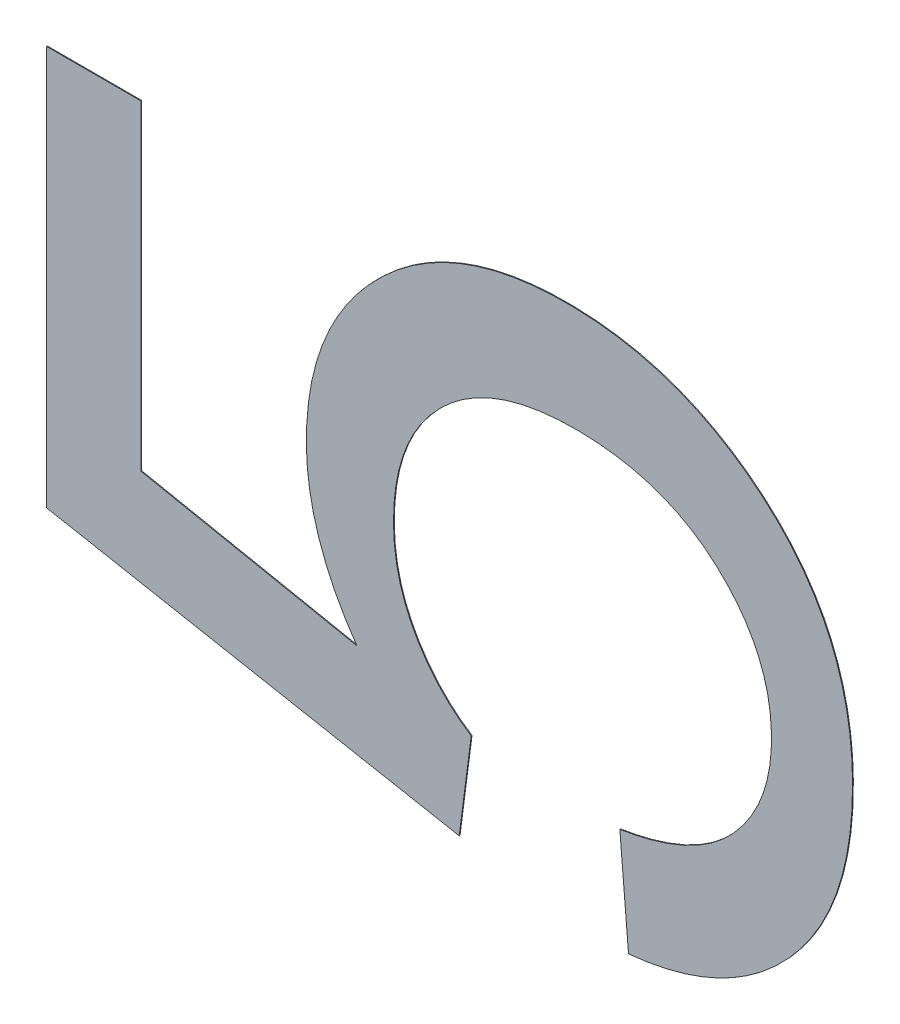
ISO-10303-21;
HEADER;
FILE_DESCRIPTION(('STEP AP214'),'2;1');
FILE_NAME('part.step','',(''),(''),'','','');
FILE_SCHEMA(('AUTOMOTIVE_DESIGN { 1 0 10303 214 1 1 1 1 }'));
ENDSEC;
DATA;
#1=APPLICATION_CONTEXT('core data for automotive mechanical design processes');
#2=APPLICATION_PROTOCOL_DEFINITION('international standard','automotive_design',2000,#1);
#3=PRODUCT_CONTEXT('',#1,'mechanical');
#4=PRODUCT('Part','Part','',(#3));
#5=PRODUCT_RELATED_PRODUCT_CATEGORY('part','',(#4));
#6=PRODUCT_DEFINITION_FORMATION('','',#4);
#7=PRODUCT_DEFINITION_CONTEXT('part definition',#1,'design');
#8=PRODUCT_DEFINITION('design','',#6,#7);
#9=PRODUCT_DEFINITION_SHAPE('','',#8);
#10=(LENGTH_UNIT() NAMED_UNIT(*) SI_UNIT(.MILLI.,.METRE.));
#11=(NAMED_UNIT(*) PLANE_ANGLE_UNIT() SI_UNIT($,.RADIAN.));
#12=(NAMED_UNIT(*) SI_UNIT($,.STERADIAN.) SOLID_ANGLE_UNIT());
#13=UNCERTAINTY_MEASURE_WITH_UNIT(LENGTH_MEASURE(1.E-05),#10,'distance_accuracy_value','');
#14=(GEOMETRIC_REPRESENTATION_CONTEXT(3) GLOBAL_UNCERTAINTY_ASSIGNED_CONTEXT((#13)) GLOBAL_UNIT_ASSIGNED_CONTEXT((#10,
#11,#12)) REPRESENTATION_CONTEXT('',''));
#15=CARTESIAN_POINT('',(0.,0.,0.));
#16=DIRECTION('',(0.,0.,1.));
#17=DIRECTION('',(1.,0.,0.));
#18=AXIS2_PLACEMENT_3D('',#15,#16,#17);
#19=CARTESIAN_POINT('',(139.654471045631,-43.7284018825457,0.002));
#20=DIRECTION('',(0.996479998500645,0.0838308570167019,0.));
#21=DIRECTION('',(-0.0838308570167019,0.996479998500645,0.));
#22=AXIS2_PLACEMENT_3D('',#19,#20,#21);
#23=PLANE('',#22);
#24=CARTESIAN_POINT('',(139.654471045631,-43.7284018825457,0.));
#25=CARTESIAN_POINT('',(139.661701111793,-43.8143441784328,0.));
#26=CARTESIAN_POINT('',(139.668931177955,-43.9002864743198,0.));
#27=CARTESIAN_POINT('',(139.676161244117,-43.9862287702068,0.));
#28=B_SPLINE_CURVE_WITH_KNOTS('',3,(#24,#25,#26,#27),.UNSPECIFIED.,.F.,.F.,(4,4),(0.,
0.0272894040807523),.UNSPECIFIED.);
#29=CARTESIAN_POINT('',(139.654471045631,-43.7284018825457,0.));
#30=VERTEX_POINT('',#29);
#31=CARTESIAN_POINT('',(139.676161244117,-43.9862287702068,0.));
#32=VERTEX_POINT('',#31);
#33=EDGE_CURVE('E96',#30,#32,#28,.T.);
#34=ORIENTED_EDGE('',*,*,#33,.T.);
#35=DIRECTION('',(0.,0.,-1.));
#36=VECTOR('',#35,1.);
#37=CARTESIAN_POINT('',(139.676161244117,-43.9862287702068,0.002));
#38=LINE('',#37,#36);
#39=CARTESIAN_POINT('',(139.676161244117,-43.9862287702068,0.002));
#40=VERTEX_POINT('',#39);
#41=EDGE_CURVE('E105',#40,#32,#38,.T.);
#42=ORIENTED_EDGE('',*,*,#41,.F.);
#43=CARTESIAN_POINT('',(139.654471045631,-43.7284018825457,0.002));
#44=CARTESIAN_POINT('',(139.661701111793,-43.8143441784328,0.002));
#45=CARTESIAN_POINT('',(139.668931177955,-43.9002864743198,0.002));
#46=CARTESIAN_POINT('',(139.676161244117,-43.9862287702068,0.002));
#47=B_SPLINE_CURVE_WITH_KNOTS('',3,(#43,#44,#45,#46),.UNSPECIFIED.,.F.,.F.,(4,4),(0.,
0.0272894040807523),.UNSPECIFIED.);
#48=CARTESIAN_POINT('',(139.654471045631,-43.7284018825457,0.002));
#49=VERTEX_POINT('',#48);
#50=EDGE_CURVE('E110',#49,#40,#47,.T.);
#51=ORIENTED_EDGE('',*,*,#50,.F.);
#52=DIRECTION('',(0.,0.,-1.));
#53=VECTOR('',#52,1.);
#54=CARTESIAN_POINT('',(139.654471045631,-43.7284018825457,0.002));
#55=LINE('',#54,#53);
#56=EDGE_CURVE('E102',#49,#30,#55,.T.);
#57=ORIENTED_EDGE('',*,*,#56,.T.);
#58=EDGE_LOOP('',(#34,#42,#51,#57));
#59=FACE_BOUND('',#58,.T.);
#60=ADVANCED_FACE('F17',(#59),#23,.F.);
#61=CARTESIAN_POINT('',(139.676161244117,-43.9862287702068,0.002));
#62=CARTESIAN_POINT('',(139.844362594639,-43.9698588090855,0.002));
#63=CARTESIAN_POINT('',(139.97941477389,-43.9039697155721,0.002));
#64=CARTESIAN_POINT('',(140.183220789851,-43.6739717618173,0.002));
#65=CARTESIAN_POINT('',(140.233967669327,-43.5254143646411,0.002));
#66=CARTESIAN_POINT('',(140.233967669327,-43.1214855739719,0.002));
#67=CARTESIAN_POINT('',(140.153345610804,-42.9467362390016,0.002));
#68=CARTESIAN_POINT('',(139.85896978656,-42.7133170248285,0.002));
#69=CARTESIAN_POINT('',(139.703171679967,-42.65985267035,0.002));
#70=CARTESIAN_POINT('',(139.331982811541,-42.65985267035,0.002));
#71=CARTESIAN_POINT('',(139.176468180888,-42.720012277471,0.002));
#72=CARTESIAN_POINT('',(138.934194152982,-42.9598308253644,0.002));
#73=CARTESIAN_POINT('',(138.874033149171,-43.1075711070188,0.002));
#74=CARTESIAN_POINT('',(138.874033149171,-43.4140986290159,0.002));
#75=CARTESIAN_POINT('',(138.915776550031,-43.5401473296502,0.002));
#76=CARTESIAN_POINT('',(138.999672600778,-43.6600572948641,0.002));
#77=B_SPLINE_CURVE_WITH_KNOTS('',3,(#61,#62,#63,#64,#65,#66,#67,#68,#69,#70,#71,#72,#73,#74,#75,
#76),.UNSPECIFIED.,.F.,.F.,(4,2,2,2,2,2,2,4),(0.0272894040807523,0.0760086306221566,
0.124727857163561,0.184310154487846,0.232955086955021,0.283905986875495,0.334856299343827,
0.373277846451094),.UNSPECIFIED.);
#78=DIRECTION('',(0.,0.,-1.));
#79=VECTOR('',#78,1.);
#80=SURFACE_OF_LINEAR_EXTRUSION('',#77,#79);
#81=CARTESIAN_POINT('',(139.676161244117,-43.9862287702068,0.));
#82=CARTESIAN_POINT('',(139.844362594639,-43.9698588090855,0.));
#83=CARTESIAN_POINT('',(139.97941477389,-43.9039697155721,0.));
#84=CARTESIAN_POINT('',(140.183220789851,-43.6739717618173,0.));
#85=CARTESIAN_POINT('',(140.233967669327,-43.5254143646411,0.));
#86=CARTESIAN_POINT('',(140.233967669327,-43.1214855739719,0.));
#87=CARTESIAN_POINT('',(140.153345610804,-42.9467362390016,0.));
#88=CARTESIAN_POINT('',(139.85896978656,-42.7133170248285,0.));
#89=CARTESIAN_POINT('',(139.703171679967,-42.65985267035,0.));
#90=CARTESIAN_POINT('',(139.331982811541,-42.65985267035,0.));
#91=CARTESIAN_POINT('',(139.176468180888,-42.720012277471,0.));
#92=CARTESIAN_POINT('',(138.934194152982,-42.9598308253644,0.));
#93=CARTESIAN_POINT('',(138.874033149171,-43.1075711070188,0.));
#94=CARTESIAN_POINT('',(138.874033149171,-43.4140986290159,0.));
#95=CARTESIAN_POINT('',(138.915776550031,-43.5401473296502,0.));
#96=CARTESIAN_POINT('',(138.999672600778,-43.6600572948641,0.));
#97=B_SPLINE_CURVE_WITH_KNOTS('',3,(#81,#82,#83,#84,#85,#86,#87,#88,#89,#90,#91,#92,#93,#94,#95,
#96),.UNSPECIFIED.,.F.,.F.,(4,2,2,2,2,2,2,4),(0.0272894040807523,0.0760086306221566,
0.124727857163561,0.184310154487846,0.232955086955021,0.283905986875495,0.334856299343827,
0.373277846451094),.UNSPECIFIED.);
#98=CARTESIAN_POINT('',(138.999672600778,-43.6600572948641,0.));
#99=VERTEX_POINT('',#98);
#100=EDGE_CURVE('E93',#32,#99,#97,.T.);
#101=ORIENTED_EDGE('',*,*,#100,.T.);
#102=DIRECTION('',(0.,0.,-1.));
#103=VECTOR('',#102,1.);
#104=CARTESIAN_POINT('',(138.999672600778,-43.6600572948641,0.002));
#105=LINE('',#104,#103);
#106=CARTESIAN_POINT('',(138.999672600778,-43.6600572948641,0.002));
#107=VERTEX_POINT('',#106);
#108=EDGE_CURVE('E101',#107,#99,#105,.T.);
#109=ORIENTED_EDGE('',*,*,#108,.F.);
#110=EDGE_CURVE('E87',#40,#107,#77,.T.);
#111=ORIENTED_EDGE('',*,*,#110,.F.);
#112=ORIENTED_EDGE('',*,*,#41,.T.);
#113=EDGE_LOOP('',(#101,#109,#111,#112));
#114=FACE_BOUND('',#113,.T.);
#115=ADVANCED_FACE('F106',(#114),#80,.F.);
#116=CARTESIAN_POINT('',(138.999672600778,-43.6600572948641,0.002));
#117=DIRECTION('',(-0.196259639647848,-0.980551963867952,0.));
#118=DIRECTION('',(0.980551963867952,-0.196259639647848,0.));
#119=AXIS2_PLACEMENT_3D('',#116,#117,#118);
#120=PLANE('',#119);
#121=CARTESIAN_POINT('',(138.999672600778,-43.6600572948641,0.));
#122=CARTESIAN_POINT('',(138.820421526499,-43.6241797967398,0.));
#123=CARTESIAN_POINT('',(138.64117045222,-43.5883022986156,0.));
#124=CARTESIAN_POINT('',(138.461919377941,-43.5524248004913,0.));
#125=B_SPLINE_CURVE_WITH_KNOTS('',3,(#121,#122,#123,#124),.UNSPECIFIED.,.F.,.F.,(4,4),
(0.373277846451094,0.428335755669182),.UNSPECIFIED.);
#126=CARTESIAN_POINT('',(138.461919377941,-43.5524248004913,0.));
#127=VERTEX_POINT('',#126);
#128=EDGE_CURVE('E98',#99,#127,#125,.T.);
#129=ORIENTED_EDGE('',*,*,#128,.T.);
#130=DIRECTION('',(0.,0.,-1.));
#131=VECTOR('',#130,1.);
#132=CARTESIAN_POINT('',(138.461919377941,-43.5524248004913,0.002));
#133=LINE('',#132,#131);
#134=CARTESIAN_POINT('',(138.461919377941,-43.5524248004913,0.002));
#135=VERTEX_POINT('',#134);
#136=EDGE_CURVE('E353',#135,#127,#133,.T.);
#137=ORIENTED_EDGE('',*,*,#136,.F.);
#138=CARTESIAN_POINT('',(138.999672600778,-43.6600572948641,0.002));
#139=CARTESIAN_POINT('',(138.820421526499,-43.6241797967398,0.002));
#140=CARTESIAN_POINT('',(138.64117045222,-43.5883022986156,0.002));
#141=CARTESIAN_POINT('',(138.461919377941,-43.5524248004913,0.002));
#142=B_SPLINE_CURVE_WITH_KNOTS('',3,(#138,#139,#140,#141),.UNSPECIFIED.,.F.,.F.,(4,4),
(0.373277846451094,0.428335755669182),.UNSPECIFIED.);
#143=EDGE_CURVE('E346',#107,#135,#142,.T.);
#144=ORIENTED_EDGE('',*,*,#143,.F.);
#145=ORIENTED_EDGE('',*,*,#108,.T.);
#146=EDGE_LOOP('',(#129,#137,#144,#145));
#147=FACE_BOUND('',#146,.T.);
#148=ADVANCED_FACE('F161',(#147),#120,.F.);
#149=CARTESIAN_POINT('',(138.461919377941,-43.5524248004913,0.002));
#150=DIRECTION('',(-1.,0.,0.));
#151=DIRECTION('',(0.,0.,1.));
#152=AXIS2_PLACEMENT_3D('',#149,#150,#151);
#153=PLANE('',#152);
#154=CARTESIAN_POINT('',(138.461919377941,-43.5524248004913,0.));
#155=CARTESIAN_POINT('',(138.461919377941,-43.2862765159268,0.));
#156=CARTESIAN_POINT('',(138.461919377941,-43.0201282313623,0.));
#157=CARTESIAN_POINT('',(138.461919377941,-42.7539799467978,0.));
#158=B_SPLINE_CURVE_WITH_KNOTS('',3,(#154,#155,#156,#157),.UNSPECIFIED.,.F.,.F.,(4,4),
(0.428335755669182,0.50849474509918),.UNSPECIFIED.);
#159=CARTESIAN_POINT('',(138.461919377941,-42.7539799467978,0.));
#160=VERTEX_POINT('',#159);
#161=EDGE_CURVE('E342',#127,#160,#158,.T.);
#162=ORIENTED_EDGE('',*,*,#161,.T.);
#163=DIRECTION('',(0.,0.,-1.));
#164=VECTOR('',#163,1.);
#165=CARTESIAN_POINT('',(138.461919377941,-42.7539799467978,0.002));
#166=LINE('',#165,#164);
#167=CARTESIAN_POINT('',(138.461919377941,-42.7539799467978,0.002));
#168=VERTEX_POINT('',#167);
#169=EDGE_CURVE('E337',#168,#160,#166,.T.);
#170=ORIENTED_EDGE('',*,*,#169,.F.);
#171=CARTESIAN_POINT('',(138.461919377941,-43.5524248004913,0.002));
#172=CARTESIAN_POINT('',(138.461919377941,-43.2862765159268,0.002));
#173=CARTESIAN_POINT('',(138.461919377941,-43.0201282313623,0.002));
#174=CARTESIAN_POINT('',(138.461919377941,-42.7539799467978,0.002));
#175=B_SPLINE_CURVE_WITH_KNOTS('',3,(#171,#172,#173,#174),.UNSPECIFIED.,.F.,.F.,(4,4),
(0.428335755669182,0.50849474509918),.UNSPECIFIED.);
#176=EDGE_CURVE('E330',#135,#168,#175,.T.);
#177=ORIENTED_EDGE('',*,*,#176,.F.);
#178=ORIENTED_EDGE('',*,*,#136,.T.);
#179=EDGE_LOOP('',(#162,#170,#177,#178));
#180=FACE_BOUND('',#179,.T.);
#181=ADVANCED_FACE('F164',(#180),#153,.F.);
#182=CARTESIAN_POINT('',(138.461919377941,-42.7539799467978,0.002));
#183=DIRECTION('',(0.,-1.,0.));
#184=DIRECTION('',(0.,0.,-1.));
#185=AXIS2_PLACEMENT_3D('',#182,#183,#184);
#186=PLANE('',#185);
#187=CARTESIAN_POINT('',(138.461919377941,-42.7539799467978,0.));
#188=CARTESIAN_POINT('',(138.383752813587,-42.7539799467978,0.));
#189=CARTESIAN_POINT('',(138.305586249233,-42.7539799467978,0.));
#190=CARTESIAN_POINT('',(138.227419684878,-42.7539799467978,0.));
#191=B_SPLINE_CURVE_WITH_KNOTS('',3,(#187,#188,#189,#190),.UNSPECIFIED.,.F.,.F.,(4,4),
(0.50849474509918,0.532037082845662),.UNSPECIFIED.);
#192=CARTESIAN_POINT('',(138.227419684878,-42.7539799467978,0.));
#193=VERTEX_POINT('',#192);
#194=EDGE_CURVE('E326',#160,#193,#191,.T.);
#195=ORIENTED_EDGE('',*,*,#194,.T.);
#196=DIRECTION('',(0.,0.,-1.));
#197=VECTOR('',#196,1.);
#198=CARTESIAN_POINT('',(138.227419684878,-42.7539799467978,0.002));
#199=LINE('',#198,#197);
#200=CARTESIAN_POINT('',(138.227419684878,-42.7539799467978,0.002));
#201=VERTEX_POINT('',#200);
#202=EDGE_CURVE('E321',#201,#193,#199,.T.);
#203=ORIENTED_EDGE('',*,*,#202,.F.);
#204=CARTESIAN_POINT('',(138.461919377941,-42.7539799467978,0.002));
#205=CARTESIAN_POINT('',(138.383752813587,-42.7539799467978,0.002));
#206=CARTESIAN_POINT('',(138.305586249233,-42.7539799467978,0.002));
#207=CARTESIAN_POINT('',(138.227419684878,-42.7539799467978,0.002));
#208=B_SPLINE_CURVE_WITH_KNOTS('',3,(#204,#205,#206,#207),.UNSPECIFIED.,.F.,.F.,(4,4),
(0.50849474509918,0.532037082845662),.UNSPECIFIED.);
#209=EDGE_CURVE('E314',#168,#201,#208,.T.);
#210=ORIENTED_EDGE('',*,*,#209,.F.);
#211=ORIENTED_EDGE('',*,*,#169,.T.);
#212=EDGE_LOOP('',(#195,#203,#210,#211));
#213=FACE_BOUND('',#212,.T.);
#214=ADVANCED_FACE('F168',(#213),#186,.F.);
#215=CARTESIAN_POINT('',(138.227419684878,-42.7539799467978,0.002));
#216=DIRECTION('',(1.,0.,0.));
#217=DIRECTION('',(0.,0.,-1.));
#218=AXIS2_PLACEMENT_3D('',#215,#216,#217);
#219=PLANE('',#218);
#220=CARTESIAN_POINT('',(138.227419684878,-42.7539799467978,0.));
#221=CARTESIAN_POINT('',(138.227419684878,-43.0856080758476,0.));
#222=CARTESIAN_POINT('',(138.227419684878,-43.4172362048975,0.));
#223=CARTESIAN_POINT('',(138.227419684878,-43.7488643339474,0.));
#224=B_SPLINE_CURVE_WITH_KNOTS('',3,(#220,#221,#222,#223),.UNSPECIFIED.,.F.,.F.,(4,4),
(0.532037082845662,0.63191740232507),.UNSPECIFIED.);
#225=CARTESIAN_POINT('',(138.227419684878,-43.7488643339474,0.));
#226=VERTEX_POINT('',#225);
#227=EDGE_CURVE('E310',#193,#226,#224,.T.);
#228=ORIENTED_EDGE('',*,*,#227,.T.);
#229=DIRECTION('',(0.,0.,-1.));
#230=VECTOR('',#229,1.);
#231=CARTESIAN_POINT('',(138.227419684878,-43.7488643339474,0.002));
#232=LINE('',#231,#230);
#233=CARTESIAN_POINT('',(138.227419684878,-43.7488643339474,0.002));
#234=VERTEX_POINT('',#233);
#235=EDGE_CURVE('E305',#234,#226,#232,.T.);
#236=ORIENTED_EDGE('',*,*,#235,.F.);
#237=CARTESIAN_POINT('',(138.227419684878,-42.7539799467978,0.002));
#238=CARTESIAN_POINT('',(138.227419684878,-43.0856080758476,0.002));
#239=CARTESIAN_POINT('',(138.227419684878,-43.4172362048975,0.002));
#240=CARTESIAN_POINT('',(138.227419684878,-43.7488643339474,0.002));
#241=B_SPLINE_CURVE_WITH_KNOTS('',3,(#237,#238,#239,#240),.UNSPECIFIED.,.F.,.F.,(4,4),
(0.532037082845662,0.63191740232507),.UNSPECIFIED.);
#242=EDGE_CURVE('E298',#201,#234,#241,.T.);
#243=ORIENTED_EDGE('',*,*,#242,.F.);
#244=ORIENTED_EDGE('',*,*,#202,.T.);
#245=EDGE_LOOP('',(#228,#236,#243,#244));
#246=FACE_BOUND('',#245,.T.);
#247=ADVANCED_FACE('F172',(#246),#219,.F.);
#248=CARTESIAN_POINT('',(138.227419684878,-43.7488643339474,0.002));
#249=DIRECTION('',(0.185186727104417,0.982703351019194,0.));
#250=DIRECTION('',(-0.982703351019194,0.185186727104417,0.));
#251=AXIS2_PLACEMENT_3D('',#248,#249,#250);
#252=PLANE('',#251);
#253=CARTESIAN_POINT('',(138.227419684878,-43.7488643339474,0.));
#254=CARTESIAN_POINT('',(138.569824705,-43.813389264034,0.));
#255=CARTESIAN_POINT('',(138.912229725121,-43.8779141941206,0.));
#256=CARTESIAN_POINT('',(139.254634745242,-43.9424391242072,0.));
#257=B_SPLINE_CURVE_WITH_KNOTS('',3,(#253,#254,#255,#256),.UNSPECIFIED.,.F.,.F.,(4,4),
(0.63191740232507,0.736858656071432),.UNSPECIFIED.);
#258=CARTESIAN_POINT('',(139.254634745242,-43.9424391242072,0.));
#259=VERTEX_POINT('',#258);
#260=EDGE_CURVE('E294',#226,#259,#257,.T.);
#261=ORIENTED_EDGE('',*,*,#260,.T.);
#262=DIRECTION('',(0.,0.,-1.));
#263=VECTOR('',#262,1.);
#264=CARTESIAN_POINT('',(139.254634745242,-43.9424391242072,0.002));
#265=LINE('',#264,#263);
#266=CARTESIAN_POINT('',(139.254634745242,-43.9424391242072,0.002));
#267=VERTEX_POINT('',#266);
#268=EDGE_CURVE('E289',#267,#259,#265,.T.);
#269=ORIENTED_EDGE('',*,*,#268,.F.);
#270=CARTESIAN_POINT('',(138.227419684878,-43.7488643339474,0.002));
#271=CARTESIAN_POINT('',(138.569824705,-43.813389264034,0.002));
#272=CARTESIAN_POINT('',(138.912229725121,-43.8779141941206,0.002));
#273=CARTESIAN_POINT('',(139.254634745242,-43.9424391242072,0.002));
#274=B_SPLINE_CURVE_WITH_KNOTS('',3,(#270,#271,#272,#273),.UNSPECIFIED.,.F.,.F.,(4,4),
(0.63191740232507,0.736858656071432),.UNSPECIFIED.);
#275=EDGE_CURVE('E282',#234,#267,#274,.T.);
#276=ORIENTED_EDGE('',*,*,#275,.F.);
#277=ORIENTED_EDGE('',*,*,#235,.T.);
#278=EDGE_LOOP('',(#261,#269,#276,#277));
#279=FACE_BOUND('',#278,.T.);
#280=ADVANCED_FACE('F176',(#279),#252,.F.);
#281=CARTESIAN_POINT('',(139.254634745242,-43.9424391242072,0.002));
#282=DIRECTION('',(-0.991698347568315,0.128586109009779,0.));
#283=DIRECTION('',(-0.128586109009779,-0.991698347568315,0.));
#284=AXIS2_PLACEMENT_3D('',#281,#282,#283);
#285=PLANE('',#284);
#286=CARTESIAN_POINT('',(139.254634745242,-43.9424391242072,0.));
#287=CARTESIAN_POINT('',(139.264593138258,-43.8656367232796,0.));
#288=CARTESIAN_POINT('',(139.274551531273,-43.788834322352,0.));
#289=CARTESIAN_POINT('',(139.284509924289,-43.7120319214243,0.));
#290=B_SPLINE_CURVE_WITH_KNOTS('',3,(#286,#287,#288,#289),.UNSPECIFIED.,.F.,.F.,(4,4),
(0.736858656071432,0.760183769762008),.UNSPECIFIED.);
#291=CARTESIAN_POINT('',(139.284509924289,-43.7120319214243,0.));
#292=VERTEX_POINT('',#291);
#293=EDGE_CURVE('E278',#259,#292,#290,.T.);
#294=ORIENTED_EDGE('',*,*,#293,.T.);
#295=DIRECTION('',(0.,0.,-1.));
#296=VECTOR('',#295,1.);
#297=CARTESIAN_POINT('',(139.284509924289,-43.7120319214243,0.002));
#298=LINE('',#297,#296);
#299=CARTESIAN_POINT('',(139.284509924289,-43.7120319214243,0.002));
#300=VERTEX_POINT('',#299);
#301=EDGE_CURVE('E273',#300,#292,#298,.T.);
#302=ORIENTED_EDGE('',*,*,#301,.F.);
#303=CARTESIAN_POINT('',(139.254634745242,-43.9424391242072,0.002));
#304=CARTESIAN_POINT('',(139.264593138258,-43.8656367232796,0.002));
#305=CARTESIAN_POINT('',(139.274551531273,-43.788834322352,0.002));
#306=CARTESIAN_POINT('',(139.284509924289,-43.7120319214243,0.002));
#307=B_SPLINE_CURVE_WITH_KNOTS('',3,(#303,#304,#305,#306),.UNSPECIFIED.,.F.,.F.,(4,4),
(0.736858656071432,0.760183769762008),.UNSPECIFIED.);
#308=EDGE_CURVE('E38',#267,#300,#307,.T.);
#309=ORIENTED_EDGE('',*,*,#308,.F.);
#310=ORIENTED_EDGE('',*,*,#268,.T.);
#311=EDGE_LOOP('',(#294,#302,#309,#310));
#312=FACE_BOUND('',#311,.T.);
#313=ADVANCED_FACE('F180',(#312),#285,.F.);
#314=CARTESIAN_POINT('',(139.284509924289,-43.7120319214243,0.002));
#315=CARTESIAN_POINT('',(139.227215060364,-43.6756087579293,0.002));
#316=CARTESIAN_POINT('',(139.180560671168,-43.6252711274813,0.002));
#317=CARTESIAN_POINT('',(139.109078538027,-43.4979179017691,0.002));
#318=CARTESIAN_POINT('',(139.090935134029,-43.4267853488849,0.002));
#319=CARTESIAN_POINT('',(139.090935134029,-43.220114589728,0.002));
#320=CARTESIAN_POINT('',(139.131450787804,-43.1173930836916,0.002));
#321=CARTESIAN_POINT('',(139.293508076489,-42.9602466219367,0.002));
#322=CARTESIAN_POINT('',(139.403601391447,-42.9205443012074,0.002));
#323=CARTESIAN_POINT('',(139.691303458154,-42.9205443012074,0.002));
#324=CARTESIAN_POINT('',(139.809576427256,-42.9614692040108,0.002));
#325=CARTESIAN_POINT('',(139.987412019865,-43.1253729760011,0.002));
#326=CARTESIAN_POINT('',(140.032207898506,-43.2254348270924,0.002));
#327=CARTESIAN_POINT('',(140.032207898506,-43.4419275629222,0.002));
#328=CARTESIAN_POINT('',(140.000695723348,-43.5258236136691,0.002));
#329=CARTESIAN_POINT('',(139.874013972705,-43.6647648885673,0.002));
#330=CARTESIAN_POINT('',(139.77970124821,-43.7091671782281,0.002));
#331=CARTESIAN_POINT('',(139.654471045631,-43.7284018825457,0.002));
#332=B_SPLINE_CURVE_WITH_KNOTS('',3,(#314,#315,#316,#317,#318,#319,#320,#321,#322,#323,#324,
#325,#326,#327,#328,#329,#330,#331),.UNSPECIFIED.,.F.,.F.,(4,2,2,2,2,2,2,2,4),
(0.760183769762008,0.780980730108963,0.801937036367264,0.835814588453224,0.869689913672064,
0.905244190869683,0.940887152320097,0.970486843489989,1.),.UNSPECIFIED.);
#333=DIRECTION('',(0.,0.,-1.));
#334=VECTOR('',#333,1.);
#335=SURFACE_OF_LINEAR_EXTRUSION('',#332,#334);
#336=CARTESIAN_POINT('',(139.284509924289,-43.7120319214243,0.));
#337=CARTESIAN_POINT('',(139.227215060364,-43.6756087579293,0.));
#338=CARTESIAN_POINT('',(139.180560671168,-43.6252711274813,0.));
#339=CARTESIAN_POINT('',(139.109078538027,-43.4979179017691,0.));
#340=CARTESIAN_POINT('',(139.090935134029,-43.4267853488849,0.));
#341=CARTESIAN_POINT('',(139.090935134029,-43.220114589728,0.));
#342=CARTESIAN_POINT('',(139.131450787804,-43.1173930836916,0.));
#343=CARTESIAN_POINT('',(139.293508076489,-42.9602466219367,0.));
#344=CARTESIAN_POINT('',(139.403601391447,-42.9205443012074,0.));
#345=CARTESIAN_POINT('',(139.691303458154,-42.9205443012074,0.));
#346=CARTESIAN_POINT('',(139.809576427256,-42.9614692040108,0.));
#347=CARTESIAN_POINT('',(139.987412019865,-43.1253729760011,0.));
#348=CARTESIAN_POINT('',(140.032207898506,-43.2254348270924,0.));
#349=CARTESIAN_POINT('',(140.032207898506,-43.4419275629222,0.));
#350=CARTESIAN_POINT('',(140.000695723348,-43.5258236136691,0.));
#351=CARTESIAN_POINT('',(139.874013972705,-43.6647648885673,0.));
#352=CARTESIAN_POINT('',(139.77970124821,-43.7091671782281,0.));
#353=CARTESIAN_POINT('',(139.654471045631,-43.7284018825457,0.));
#354=B_SPLINE_CURVE_WITH_KNOTS('',3,(#336,#337,#338,#339,#340,#341,#342,#343,#344,#345,#346,
#347,#348,#349,#350,#351,#352,#353),.UNSPECIFIED.,.F.,.F.,(4,2,2,2,2,2,2,2,4),
(0.760183769762008,0.780980730108963,0.801937036367264,0.835814588453224,0.869689913672064,
0.905244190869683,0.940887152320097,0.970486843489989,1.),.UNSPECIFIED.);
#355=EDGE_CURVE('E30',#292,#30,#354,.T.);
#356=ORIENTED_EDGE('',*,*,#355,.T.);
#357=ORIENTED_EDGE('',*,*,#56,.F.);
#358=EDGE_CURVE('E11',#300,#49,#332,.T.);
#359=ORIENTED_EDGE('',*,*,#358,.F.);
#360=ORIENTED_EDGE('',*,*,#301,.T.);
#361=EDGE_LOOP('',(#356,#357,#359,#360));
#362=FACE_BOUND('',#361,.T.);
#363=ADVANCED_FACE('F184',(#362),#335,.F.);
#364=CARTESIAN_POINT('',(139.853272300584,-42.7315940861178,0.002));
#365=DIRECTION('',(0.,0.,-1.));
#366=DIRECTION('',(-1.,0.,0.));
#367=AXIS2_PLACEMENT_3D('',#364,#365,#366);
#368=PLANE('',#367);
#369=ORIENTED_EDGE('',*,*,#50,.T.);
#370=ORIENTED_EDGE('',*,*,#110,.T.);
#371=ORIENTED_EDGE('',*,*,#143,.T.);
#372=ORIENTED_EDGE('',*,*,#176,.T.);
#373=ORIENTED_EDGE('',*,*,#209,.T.);
#374=ORIENTED_EDGE('',*,*,#242,.T.);
#375=ORIENTED_EDGE('',*,*,#275,.T.);
#376=ORIENTED_EDGE('',*,*,#308,.T.);
#377=ORIENTED_EDGE('',*,*,#358,.T.);
#378=EDGE_LOOP('',(#369,#370,#371,#372,#373,#374,#375,#376,#377));
#379=FACE_BOUND('',#378,.T.);
#380=ADVANCED_FACE('F187',(#379),#368,.F.);
#381=CARTESIAN_POINT('',(139.853272300584,-42.7315940861178,0.));
#382=DIRECTION('',(0.,0.,-1.));
#383=DIRECTION('',(-1.,0.,0.));
#384=AXIS2_PLACEMENT_3D('',#381,#382,#383);
#385=PLANE('',#384);
#386=ORIENTED_EDGE('',*,*,#33,.F.);
#387=ORIENTED_EDGE('',*,*,#355,.F.);
#388=ORIENTED_EDGE('',*,*,#293,.F.);
#389=ORIENTED_EDGE('',*,*,#260,.F.);
#390=ORIENTED_EDGE('',*,*,#227,.F.);
#391=ORIENTED_EDGE('',*,*,#194,.F.);
#392=ORIENTED_EDGE('',*,*,#161,.F.);
#393=ORIENTED_EDGE('',*,*,#128,.F.);
#394=ORIENTED_EDGE('',*,*,#100,.F.);
#395=EDGE_LOOP('',(#386,#387,#388,#389,#390,#391,#392,#393,#394));
#396=FACE_BOUND('',#395,.T.);
#397=ADVANCED_FACE('F19',(#396),#385,.T.);
#398=CLOSED_SHELL('',(#60,#115,#148,#181,#214,#247,#280,#313,#363,#380,#397));
#399=MANIFOLD_SOLID_BREP('B1',#398);
#400=ADVANCED_BREP_SHAPE_REPRESENTATION('',(#18,#399),#14);
#401=SHAPE_DEFINITION_REPRESENTATION(#9,#400);
ENDSEC;
END-ISO-10303-21;
